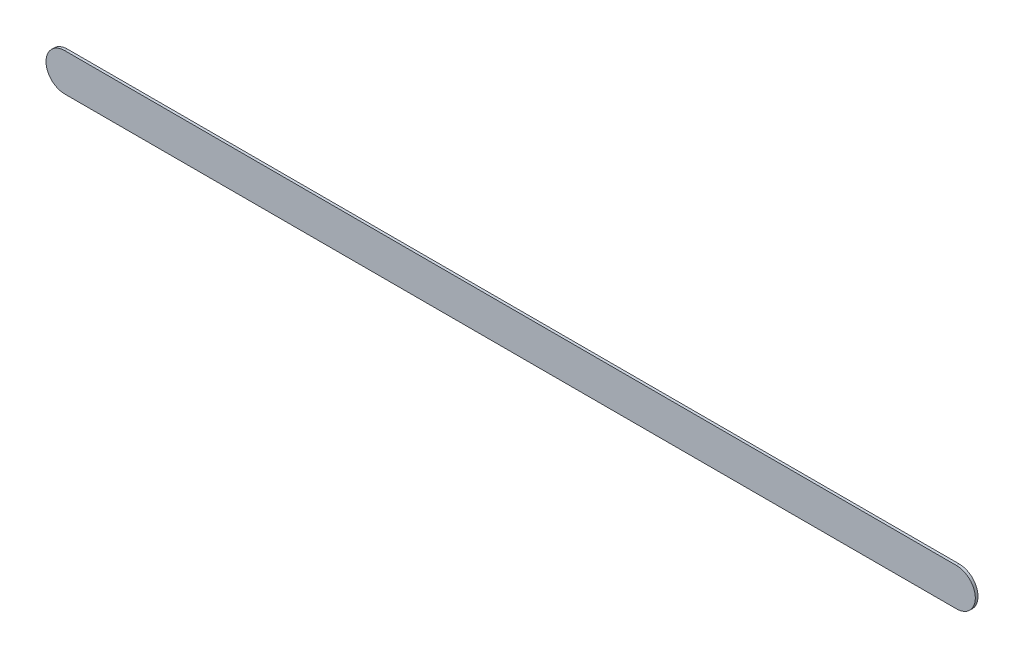
ISO-10303-21;
HEADER;
FILE_DESCRIPTION(('STEP AP214'),'2;1');
FILE_NAME('part.step','',(''),(''),'','','');
FILE_SCHEMA(('AUTOMOTIVE_DESIGN { 1 0 10303 214 1 1 1 1 }'));
ENDSEC;
DATA;
#1=APPLICATION_CONTEXT('core data for automotive mechanical design processes');
#2=APPLICATION_PROTOCOL_DEFINITION('international standard','automotive_design',2000,#1);
#3=PRODUCT_CONTEXT('',#1,'mechanical');
#4=PRODUCT('Part','Part','',(#3));
#5=PRODUCT_RELATED_PRODUCT_CATEGORY('part','',(#4));
#6=PRODUCT_DEFINITION_FORMATION('','',#4);
#7=PRODUCT_DEFINITION_CONTEXT('part definition',#1,'design');
#8=PRODUCT_DEFINITION('design','',#6,#7);
#9=PRODUCT_DEFINITION_SHAPE('','',#8);
#10=(LENGTH_UNIT() NAMED_UNIT(*) SI_UNIT(.MILLI.,.METRE.));
#11=(NAMED_UNIT(*) PLANE_ANGLE_UNIT() SI_UNIT($,.RADIAN.));
#12=(NAMED_UNIT(*) SI_UNIT($,.STERADIAN.) SOLID_ANGLE_UNIT());
#13=UNCERTAINTY_MEASURE_WITH_UNIT(LENGTH_MEASURE(1.E-05),#10,'distance_accuracy_value','');
#14=(GEOMETRIC_REPRESENTATION_CONTEXT(3) GLOBAL_UNCERTAINTY_ASSIGNED_CONTEXT((#13)) GLOBAL_UNIT_ASSIGNED_CONTEXT((#10,
#11,#12)) REPRESENTATION_CONTEXT('',''));
#15=CARTESIAN_POINT('',(0.,0.,0.));
#16=DIRECTION('',(0.,0.,1.));
#17=DIRECTION('',(1.,0.,0.));
#18=AXIS2_PLACEMENT_3D('',#15,#16,#17);
#19=CARTESIAN_POINT('',(92.54500414,107.87201184,0.));
#20=DIRECTION('',(0.,1.,0.));
#21=DIRECTION('',(1.,0.,0.));
#22=AXIS2_PLACEMENT_3D('',#19,#20,#21);
#23=PLANE('',#22);
#24=DIRECTION('',(1.,0.,0.));
#25=VECTOR('',#24,1.);
#26=CARTESIAN_POINT('',(92.54500414,107.87201184,0.03556));
#27=LINE('',#26,#25);
#28=CARTESIAN_POINT('',(92.54500414,107.87201184,0.03556));
#29=VERTEX_POINT('',#28);
#30=CARTESIAN_POINT('',(104.39999948,107.87201184,0.03556));
#31=VERTEX_POINT('',#30);
#32=EDGE_CURVE('E11',#29,#31,#27,.T.);
#33=ORIENTED_EDGE('',*,*,#32,.F.);
#34=DIRECTION('',(0.,0.,1.));
#35=VECTOR('',#34,1.);
#36=CARTESIAN_POINT('',(92.54500414,107.87201184,0.));
#37=LINE('',#36,#35);
#38=CARTESIAN_POINT('',(92.54500414,107.87201184,0.));
#39=VERTEX_POINT('',#38);
#40=EDGE_CURVE('E24',#39,#29,#37,.T.);
#41=ORIENTED_EDGE('',*,*,#40,.F.);
#42=DIRECTION('',(1.,0.,0.));
#43=VECTOR('',#42,1.);
#44=CARTESIAN_POINT('',(92.54500414,107.87201184,0.));
#45=LINE('',#44,#43);
#46=CARTESIAN_POINT('',(104.39999948,107.87201184,0.));
#47=VERTEX_POINT('',#46);
#48=EDGE_CURVE('E75',#39,#47,#45,.T.);
#49=ORIENTED_EDGE('',*,*,#48,.T.);
#50=DIRECTION('',(0.,0.,1.));
#51=VECTOR('',#50,1.);
#52=CARTESIAN_POINT('',(104.39999948,107.87201184,0.));
#53=LINE('',#52,#51);
#54=EDGE_CURVE('E37',#47,#31,#53,.T.);
#55=ORIENTED_EDGE('',*,*,#54,.T.);
#56=EDGE_LOOP('',(#33,#41,#49,#55));
#57=FACE_BOUND('',#56,.T.);
#58=ADVANCED_FACE('F17',(#57),#23,.F.);
#59=CARTESIAN_POINT('',(104.39999948,108.12201134,0.));
#60=DIRECTION('',(0.,0.,-1.));
#61=DIRECTION('',(1.13687065095746E-13,-1.,0.));
#62=AXIS2_PLACEMENT_3D('',#59,#60,#61);
#63=CYLINDRICAL_SURFACE('',#62,0.249999500000006);
#64=CARTESIAN_POINT('',(104.39999948,108.12201134,0.03556));
#65=DIRECTION('',(0.,0.,1.));
#66=DIRECTION('',(1.13687065095746E-13,-1.,0.));
#67=AXIS2_PLACEMENT_3D('',#64,#65,#66);
#68=CIRCLE('',#67,0.249999500000006);
#69=CARTESIAN_POINT('',(104.39999948,108.37201084,0.03556));
#70=VERTEX_POINT('',#69);
#71=EDGE_CURVE('E83',#31,#70,#68,.T.);
#72=ORIENTED_EDGE('',*,*,#71,.F.);
#73=ORIENTED_EDGE('',*,*,#54,.F.);
#74=CARTESIAN_POINT('',(104.39999948,108.12201134,0.));
#75=DIRECTION('',(0.,0.,1.));
#76=DIRECTION('',(1.13687065095746E-13,-1.,0.));
#77=AXIS2_PLACEMENT_3D('',#74,#75,#76);
#78=CIRCLE('',#77,0.249999500000006);
#79=CARTESIAN_POINT('',(104.39999948,108.37201084,0.));
#80=VERTEX_POINT('',#79);
#81=EDGE_CURVE('E81',#47,#80,#78,.T.);
#82=ORIENTED_EDGE('',*,*,#81,.T.);
#83=DIRECTION('',(0.,0.,1.));
#84=VECTOR('',#83,1.);
#85=CARTESIAN_POINT('',(104.39999948,108.37201084,0.));
#86=LINE('',#85,#84);
#87=EDGE_CURVE('E67',#80,#70,#86,.T.);
#88=ORIENTED_EDGE('',*,*,#87,.T.);
#89=EDGE_LOOP('',(#72,#73,#82,#88));
#90=FACE_BOUND('',#89,.T.);
#91=ADVANCED_FACE('F89',(#90),#63,.T.);
#92=CARTESIAN_POINT('',(104.39999948,108.37201084,0.));
#93=DIRECTION('',(0.,-1.,0.));
#94=DIRECTION('',(-1.,0.,0.));
#95=AXIS2_PLACEMENT_3D('',#92,#93,#94);
#96=PLANE('',#95);
#97=DIRECTION('',(-1.,0.,0.));
#98=VECTOR('',#97,1.);
#99=CARTESIAN_POINT('',(104.39999948,108.37201084,0.03556));
#100=LINE('',#99,#98);
#101=CARTESIAN_POINT('',(92.54500414,108.37201084,0.03556));
#102=VERTEX_POINT('',#101);
#103=EDGE_CURVE('E71',#70,#102,#100,.T.);
#104=ORIENTED_EDGE('',*,*,#103,.F.);
#105=ORIENTED_EDGE('',*,*,#87,.F.);
#106=DIRECTION('',(-1.,0.,0.));
#107=VECTOR('',#106,1.);
#108=CARTESIAN_POINT('',(104.39999948,108.37201084,0.));
#109=LINE('',#108,#107);
#110=CARTESIAN_POINT('',(92.54500414,108.37201084,0.));
#111=VERTEX_POINT('',#110);
#112=EDGE_CURVE('E63',#80,#111,#109,.T.);
#113=ORIENTED_EDGE('',*,*,#112,.T.);
#114=DIRECTION('',(0.,0.,1.));
#115=VECTOR('',#114,1.);
#116=CARTESIAN_POINT('',(92.54500414,108.37201084,0.));
#117=LINE('',#116,#115);
#118=EDGE_CURVE('E53',#111,#102,#117,.T.);
#119=ORIENTED_EDGE('',*,*,#118,.T.);
#120=EDGE_LOOP('',(#104,#105,#113,#119));
#121=FACE_BOUND('',#120,.T.);
#122=ADVANCED_FACE('F66',(#121),#96,.F.);
#123=CARTESIAN_POINT('',(92.54500414,108.12201134,0.));
#124=DIRECTION('',(0.,0.,-1.));
#125=DIRECTION('',(0.,1.,0.));
#126=AXIS2_PLACEMENT_3D('',#123,#124,#125);
#127=CYLINDRICAL_SURFACE('',#126,0.249999500000001);
#128=CARTESIAN_POINT('',(92.54500414,108.12201134,0.03556));
#129=DIRECTION('',(0.,0.,1.));
#130=DIRECTION('',(0.,1.,0.));
#131=AXIS2_PLACEMENT_3D('',#128,#129,#130);
#132=CIRCLE('',#131,0.249999500000001);
#133=EDGE_CURVE('E59',#102,#29,#132,.T.);
#134=ORIENTED_EDGE('',*,*,#133,.F.);
#135=ORIENTED_EDGE('',*,*,#118,.F.);
#136=CARTESIAN_POINT('',(92.54500414,108.12201134,0.));
#137=DIRECTION('',(0.,0.,1.));
#138=DIRECTION('',(0.,1.,0.));
#139=AXIS2_PLACEMENT_3D('',#136,#137,#138);
#140=CIRCLE('',#139,0.249999500000001);
#141=EDGE_CURVE('E57',#111,#39,#140,.T.);
#142=ORIENTED_EDGE('',*,*,#141,.T.);
#143=ORIENTED_EDGE('',*,*,#40,.T.);
#144=EDGE_LOOP('',(#134,#135,#142,#143));
#145=FACE_BOUND('',#144,.T.);
#146=ADVANCED_FACE('F55',(#145),#127,.T.);
#147=CARTESIAN_POINT('',(92.54500414,107.87201184,0.));
#148=DIRECTION('',(0.,0.,-1.));
#149=DIRECTION('',(-1.,0.,0.));
#150=AXIS2_PLACEMENT_3D('',#147,#148,#149);
#151=PLANE('',#150);
#152=ORIENTED_EDGE('',*,*,#141,.F.);
#153=ORIENTED_EDGE('',*,*,#112,.F.);
#154=ORIENTED_EDGE('',*,*,#81,.F.);
#155=ORIENTED_EDGE('',*,*,#48,.F.);
#156=EDGE_LOOP('',(#152,#153,#154,#155));
#157=FACE_BOUND('',#156,.T.);
#158=ADVANCED_FACE('F74',(#157),#151,.T.);
#159=CARTESIAN_POINT('',(92.54500414,107.87201184,0.03556));
#160=DIRECTION('',(0.,0.,-1.));
#161=DIRECTION('',(-1.,0.,0.));
#162=AXIS2_PLACEMENT_3D('',#159,#160,#161);
#163=PLANE('',#162);
#164=ORIENTED_EDGE('',*,*,#32,.T.);
#165=ORIENTED_EDGE('',*,*,#71,.T.);
#166=ORIENTED_EDGE('',*,*,#103,.T.);
#167=ORIENTED_EDGE('',*,*,#133,.T.);
#168=EDGE_LOOP('',(#164,#165,#166,#167));
#169=FACE_BOUND('',#168,.T.);
#170=ADVANCED_FACE('F91',(#169),#163,.F.);
#171=CLOSED_SHELL('',(#58,#91,#122,#146,#158,#170));
#172=MANIFOLD_SOLID_BREP('B1',#171);
#173=ADVANCED_BREP_SHAPE_REPRESENTATION('',(#18,#172),#14);
#174=SHAPE_DEFINITION_REPRESENTATION(#9,#173);
ENDSEC;
END-ISO-10303-21;
